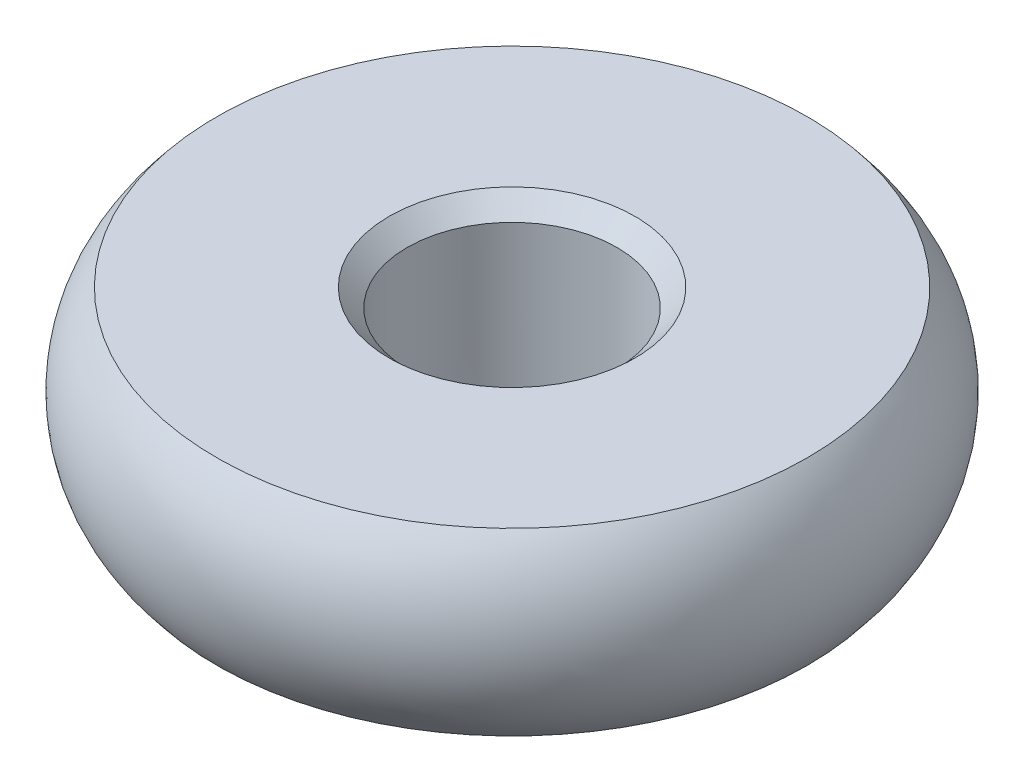
ISO-10303-21;
HEADER;
FILE_DESCRIPTION(('STEP AP214'),'2;1');
FILE_NAME('part.step','',(''),(''),'','','');
FILE_SCHEMA(('AUTOMOTIVE_DESIGN { 1 0 10303 214 1 1 1 1 }'));
ENDSEC;
DATA;
#1=APPLICATION_CONTEXT('core data for automotive mechanical design processes');
#2=APPLICATION_PROTOCOL_DEFINITION('international standard','automotive_design',2000,#1);
#3=PRODUCT_CONTEXT('',#1,'mechanical');
#4=PRODUCT('Part','Part','',(#3));
#5=PRODUCT_RELATED_PRODUCT_CATEGORY('part','',(#4));
#6=PRODUCT_DEFINITION_FORMATION('','',#4);
#7=PRODUCT_DEFINITION_CONTEXT('part definition',#1,'design');
#8=PRODUCT_DEFINITION('design','',#6,#7);
#9=PRODUCT_DEFINITION_SHAPE('','',#8);
#10=(LENGTH_UNIT() NAMED_UNIT(*) SI_UNIT(.MILLI.,.METRE.));
#11=(NAMED_UNIT(*) PLANE_ANGLE_UNIT() SI_UNIT($,.RADIAN.));
#12=(NAMED_UNIT(*) SI_UNIT($,.STERADIAN.) SOLID_ANGLE_UNIT());
#13=UNCERTAINTY_MEASURE_WITH_UNIT(LENGTH_MEASURE(1.E-05),#10,'distance_accuracy_value','');
#14=(GEOMETRIC_REPRESENTATION_CONTEXT(3) GLOBAL_UNCERTAINTY_ASSIGNED_CONTEXT((#13)) GLOBAL_UNIT_ASSIGNED_CONTEXT((#10,
#11,#12)) REPRESENTATION_CONTEXT('',''));
#15=CARTESIAN_POINT('',(0.,0.,0.));
#16=DIRECTION('',(0.,0.,1.));
#17=DIRECTION('',(1.,0.,0.));
#18=AXIS2_PLACEMENT_3D('',#15,#16,#17);
#19=CARTESIAN_POINT('',(0.,-1.11022302462516E-13,0.));
#20=DIRECTION('',(0.,-1.,0.));
#21=DIRECTION('',(1.,0.,0.));
#22=AXIS2_PLACEMENT_3D('',#19,#20,#21);
#23=TOROIDAL_SURFACE('',#22,32.5,22.5);
#24=CARTESIAN_POINT('',(0.,14.9999999999998,0.));
#25=DIRECTION('',(0.,-1.,0.));
#26=DIRECTION('',(1.,0.,0.));
#27=AXIS2_PLACEMENT_3D('',#24,#25,#26);
#28=CIRCLE('',#27,49.2705098312485);
#29=CARTESIAN_POINT('',(49.2705098312485,15.,0.));
#30=VERTEX_POINT('',#29);
#31=EDGE_CURVE('E56',#30,#30,#28,.T.);
#32=ORIENTED_EDGE('',*,*,#31,.T.);
#33=EDGE_LOOP('',(#32));
#34=FACE_BOUND('',#33,.T.);
#35=CARTESIAN_POINT('',(0.,-15.0000000000002,0.));
#36=DIRECTION('',(0.,-1.,0.));
#37=DIRECTION('',(1.,0.,0.));
#38=AXIS2_PLACEMENT_3D('',#35,#36,#37);
#39=CIRCLE('',#38,49.2705098312484);
#40=CARTESIAN_POINT('',(49.2705098312485,-15.0000000000001,0.));
#41=VERTEX_POINT('',#40);
#42=EDGE_CURVE('E53',#41,#41,#39,.T.);
#43=ORIENTED_EDGE('',*,*,#42,.F.);
#44=EDGE_LOOP('',(#43));
#45=FACE_BOUND('',#44,.T.);
#46=ADVANCED_FACE('F32',(#34,#45),#23,.T.);
#47=CARTESIAN_POINT('',(17.5,-15.0000000000001,0.));
#48=DIRECTION('',(0.,-1.,0.));
#49=DIRECTION('',(1.,0.,0.));
#50=AXIS2_PLACEMENT_3D('',#47,#48,#49);
#51=PLANE('',#50);
#52=CARTESIAN_POINT('',(0.,-15.0000000000001,0.));
#53=DIRECTION('',(0.,-1.,0.));
#54=DIRECTION('',(1.,0.,0.));
#55=AXIS2_PLACEMENT_3D('',#52,#53,#54);
#56=CIRCLE('',#55,20.4999999999999);
#57=CARTESIAN_POINT('',(20.4999999999999,-15.,0.));
#58=VERTEX_POINT('',#57);
#59=EDGE_CURVE('E10',#58,#58,#56,.F.);
#60=ORIENTED_EDGE('',*,*,#59,.T.);
#61=EDGE_LOOP('',(#60));
#62=FACE_BOUND('',#61,.T.);
#63=ORIENTED_EDGE('',*,*,#42,.T.);
#64=EDGE_LOOP('',(#63));
#65=FACE_BOUND('',#64,.T.);
#66=ADVANCED_FACE('F73',(#62,#65),#51,.T.);
#67=CARTESIAN_POINT('',(2.95080809831719E-12,-860.23145820484,0.));
#68=DIRECTION('',(0.,-1.,0.));
#69=DIRECTION('',(1.,0.,0.));
#70=AXIS2_PLACEMENT_3D('',#67,#68,#69);
#71=CYLINDRICAL_SURFACE('',#70,17.5);
#72=CARTESIAN_POINT('',(0.,11.9999999999997,0.));
#73=DIRECTION('',(0.,1.,0.));
#74=DIRECTION('',(-1.,0.,0.));
#75=AXIS2_PLACEMENT_3D('',#72,#73,#74);
#76=CIRCLE('',#75,17.5);
#77=CARTESIAN_POINT('',(-17.5,11.9999999999996,0.));
#78=VERTEX_POINT('',#77);
#79=EDGE_CURVE('E40',#78,#78,#76,.T.);
#80=ORIENTED_EDGE('',*,*,#79,.T.);
#81=EDGE_LOOP('',(#80));
#82=FACE_BOUND('',#81,.T.);
#83=CARTESIAN_POINT('',(0.,-12.0000000000002,0.));
#84=DIRECTION('',(0.,-1.,0.));
#85=DIRECTION('',(1.,0.,0.));
#86=AXIS2_PLACEMENT_3D('',#83,#84,#85);
#87=CIRCLE('',#86,17.5);
#88=CARTESIAN_POINT('',(17.5,-12.0000000000002,0.));
#89=VERTEX_POINT('',#88);
#90=EDGE_CURVE('E44',#89,#89,#87,.T.);
#91=ORIENTED_EDGE('',*,*,#90,.T.);
#92=EDGE_LOOP('',(#91));
#93=FACE_BOUND('',#92,.T.);
#94=ADVANCED_FACE('F65',(#82,#93),#71,.F.);
#95=CARTESIAN_POINT('',(49.2705098312485,15.0000000000001,0.));
#96=DIRECTION('',(0.,1.,0.));
#97=DIRECTION('',(-1.,0.,0.));
#98=AXIS2_PLACEMENT_3D('',#95,#96,#97);
#99=PLANE('',#98);
#100=CARTESIAN_POINT('',(0.,14.9999999999999,0.));
#101=DIRECTION('',(0.,1.,0.));
#102=DIRECTION('',(-1.,0.,0.));
#103=AXIS2_PLACEMENT_3D('',#100,#101,#102);
#104=CIRCLE('',#103,20.5000000000002);
#105=CARTESIAN_POINT('',(-20.5000000000002,14.9999999999998,0.));
#106=VERTEX_POINT('',#105);
#107=EDGE_CURVE('E48',#106,#106,#104,.F.);
#108=ORIENTED_EDGE('',*,*,#107,.T.);
#109=EDGE_LOOP('',(#108));
#110=FACE_BOUND('',#109,.T.);
#111=ORIENTED_EDGE('',*,*,#31,.F.);
#112=EDGE_LOOP('',(#111));
#113=FACE_BOUND('',#112,.T.);
#114=ADVANCED_FACE('F62',(#110,#113),#99,.T.);
#115=CARTESIAN_POINT('',(0.,14.9999999999998,0.));
#116=DIRECTION('',(0.,1.,0.));
#117=DIRECTION('',(-1.,0.,0.));
#118=AXIS2_PLACEMENT_3D('',#115,#116,#117);
#119=CONICAL_SURFACE('',#118,20.5000000000001,0.785398163397447);
#120=ORIENTED_EDGE('',*,*,#79,.F.);
#121=EDGE_LOOP('',(#120));
#122=FACE_BOUND('',#121,.T.);
#123=ORIENTED_EDGE('',*,*,#107,.F.);
#124=EDGE_LOOP('',(#123));
#125=FACE_BOUND('',#124,.T.);
#126=ADVANCED_FACE('F64',(#122,#125),#119,.F.);
#127=CARTESIAN_POINT('',(0.,-12.0000000000002,0.));
#128=DIRECTION('',(0.,-1.,0.));
#129=DIRECTION('',(1.,0.,0.));
#130=AXIS2_PLACEMENT_3D('',#127,#128,#129);
#131=CONICAL_SURFACE('',#130,17.5,0.785398163397456);
#132=ORIENTED_EDGE('',*,*,#59,.F.);
#133=EDGE_LOOP('',(#132));
#134=FACE_BOUND('',#133,.T.);
#135=ORIENTED_EDGE('',*,*,#90,.F.);
#136=EDGE_LOOP('',(#135));
#137=FACE_BOUND('',#136,.T.);
#138=ADVANCED_FACE('F35',(#134,#137),#131,.F.);
#139=CLOSED_SHELL('',(#46,#66,#94,#114,#126,#138));
#140=MANIFOLD_SOLID_BREP('B2',#139);
#141=ADVANCED_BREP_SHAPE_REPRESENTATION('',(#18,#140),#14);
#142=SHAPE_DEFINITION_REPRESENTATION(#9,#141);
ENDSEC;
END-ISO-10303-21;
